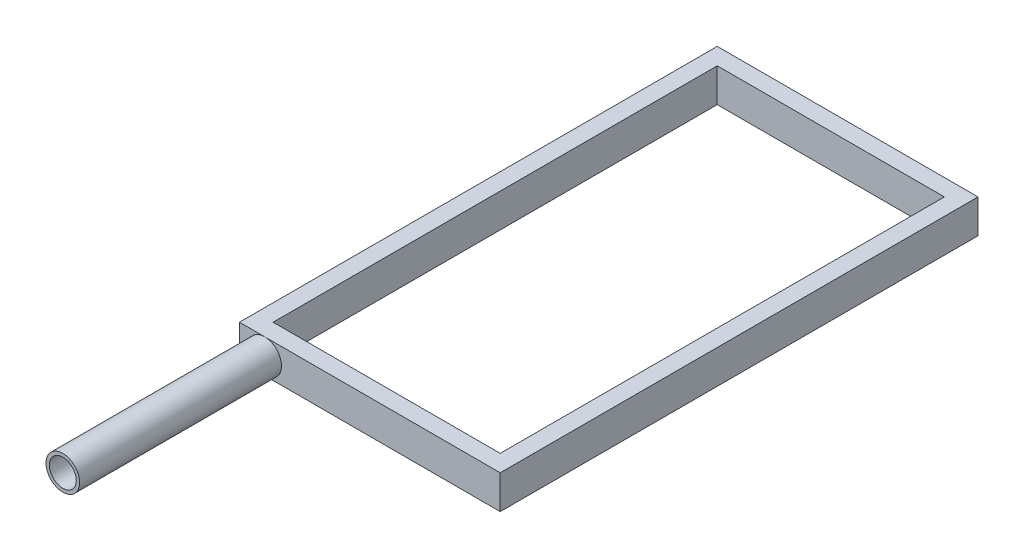
ISO-10303-21;
HEADER;
FILE_DESCRIPTION(('STEP AP214'),'2;1');
FILE_NAME('part.step','',(''),(''),'','','');
FILE_SCHEMA(('AUTOMOTIVE_DESIGN { 1 0 10303 214 1 1 1 1 }'));
ENDSEC;
DATA;
#1=APPLICATION_CONTEXT('core data for automotive mechanical design processes');
#2=APPLICATION_PROTOCOL_DEFINITION('international standard','automotive_design',2000,#1);
#3=PRODUCT_CONTEXT('',#1,'mechanical');
#4=PRODUCT('Part','Part','',(#3));
#5=PRODUCT_RELATED_PRODUCT_CATEGORY('part','',(#4));
#6=PRODUCT_DEFINITION_FORMATION('','',#4);
#7=PRODUCT_DEFINITION_CONTEXT('part definition',#1,'design');
#8=PRODUCT_DEFINITION('design','',#6,#7);
#9=PRODUCT_DEFINITION_SHAPE('','',#8);
#10=(LENGTH_UNIT() NAMED_UNIT(*) SI_UNIT(.MILLI.,.METRE.));
#11=(NAMED_UNIT(*) PLANE_ANGLE_UNIT() SI_UNIT($,.RADIAN.));
#12=(NAMED_UNIT(*) SI_UNIT($,.STERADIAN.) SOLID_ANGLE_UNIT());
#13=UNCERTAINTY_MEASURE_WITH_UNIT(LENGTH_MEASURE(1.E-05),#10,'distance_accuracy_value','');
#14=(GEOMETRIC_REPRESENTATION_CONTEXT(3) GLOBAL_UNCERTAINTY_ASSIGNED_CONTEXT((#13)) GLOBAL_UNIT_ASSIGNED_CONTEXT((#10,
#11,#12)) REPRESENTATION_CONTEXT('',''));
#15=CARTESIAN_POINT('',(0.,0.,0.));
#16=DIRECTION('',(0.,0.,1.));
#17=DIRECTION('',(1.,0.,0.));
#18=AXIS2_PLACEMENT_3D('',#15,#16,#17);
#19=CARTESIAN_POINT('',(0.,20.,10.));
#20=DIRECTION('',(0.,0.,-1.));
#21=DIRECTION('',(-1.,0.,0.));
#22=AXIS2_PLACEMENT_3D('',#19,#20,#21);
#23=PLANE('',#22);
#24=CARTESIAN_POINT('',(5.00000000000004,10.,10.));
#25=DIRECTION('',(0.,0.,1.));
#26=DIRECTION('',(1.,0.,0.));
#27=AXIS2_PLACEMENT_3D('',#24,#25,#26);
#28=CIRCLE('',#27,10.);
#29=CARTESIAN_POINT('',(5.00000000000004,20.,10.));
#30=VERTEX_POINT('',#29);
#31=CARTESIAN_POINT('',(5.00000000000004,0.,10.));
#32=VERTEX_POINT('',#31);
#33=EDGE_CURVE('E84',#30,#32,#28,.T.);
#34=ORIENTED_EDGE('',*,*,#33,.F.);
#35=DIRECTION('',(1.,0.,0.));
#36=VECTOR('',#35,1.);
#37=CARTESIAN_POINT('',(0.,20.,10.));
#38=LINE('',#37,#36);
#39=CARTESIAN_POINT('',(-9.99999999999991,20.,10.));
#40=VERTEX_POINT('',#39);
#41=EDGE_CURVE('E145',#40,#30,#38,.T.);
#42=ORIENTED_EDGE('',*,*,#41,.F.);
#43=DIRECTION('',(0.,-1.,0.));
#44=VECTOR('',#43,1.);
#45=CARTESIAN_POINT('',(-9.99999999999991,20.,10.));
#46=LINE('',#45,#44);
#47=CARTESIAN_POINT('',(-9.99999999999991,0.,10.));
#48=VERTEX_POINT('',#47);
#49=EDGE_CURVE('E77',#40,#48,#46,.T.);
#50=ORIENTED_EDGE('',*,*,#49,.T.);
#51=DIRECTION('',(1.,0.,0.));
#52=VECTOR('',#51,1.);
#53=CARTESIAN_POINT('',(0.,0.,10.));
#54=LINE('',#53,#52);
#55=EDGE_CURVE('E166',#48,#32,#54,.T.);
#56=ORIENTED_EDGE('',*,*,#55,.T.);
#57=EDGE_LOOP('',(#34,#42,#50,#56));
#58=FACE_BOUND('',#57,.T.);
#59=ADVANCED_FACE('F73',(#58),#23,.F.);
#60=CARTESIAN_POINT('',(-9.99999999999991,20.,10.));
#61=DIRECTION('',(0.,1.,0.));
#62=DIRECTION('',(0.,0.,1.));
#63=AXIS2_PLACEMENT_3D('',#60,#61,#62);
#64=PLANE('',#63);
#65=DIRECTION('',(0.,0.,1.));
#66=VECTOR('',#65,1.);
#67=CARTESIAN_POINT('',(-9.99999999999991,20.,-264.));
#68=LINE('',#67,#66);
#69=CARTESIAN_POINT('',(-9.99999999999999,20.,-274.));
#70=VERTEX_POINT('',#69);
#71=EDGE_CURVE('E151',#70,#40,#68,.T.);
#72=ORIENTED_EDGE('',*,*,#71,.T.);
#73=ORIENTED_EDGE('',*,*,#41,.T.);
#74=CARTESIAN_POINT('',(145.,20.,10.));
#75=VERTEX_POINT('',#74);
#76=EDGE_CURVE('E148',#30,#75,#38,.T.);
#77=ORIENTED_EDGE('',*,*,#76,.T.);
#78=DIRECTION('',(0.,0.,-1.));
#79=VECTOR('',#78,1.);
#80=CARTESIAN_POINT('',(145.,20.,-264.));
#81=LINE('',#80,#79);
#82=CARTESIAN_POINT('',(145.,20.,-274.));
#83=VERTEX_POINT('',#82);
#84=EDGE_CURVE('E157',#75,#83,#81,.T.);
#85=ORIENTED_EDGE('',*,*,#84,.T.);
#86=DIRECTION('',(-1.,0.,0.));
#87=VECTOR('',#86,1.);
#88=CARTESIAN_POINT('',(0.,20.,-274.));
#89=LINE('',#88,#87);
#90=EDGE_CURVE('E232',#83,#70,#89,.T.);
#91=ORIENTED_EDGE('',*,*,#90,.T.);
#92=EDGE_LOOP('',(#72,#73,#77,#85,#91));
#93=FACE_BOUND('',#92,.T.);
#94=DIRECTION('',(1.,0.,0.));
#95=VECTOR('',#94,1.);
#96=CARTESIAN_POINT('',(0.,20.,0.));
#97=LINE('',#96,#95);
#98=CARTESIAN_POINT('',(0.,20.,0.));
#99=VERTEX_POINT('',#98);
#100=CARTESIAN_POINT('',(135.,20.,0.));
#101=VERTEX_POINT('',#100);
#102=EDGE_CURVE('E269',#99,#101,#97,.T.);
#103=ORIENTED_EDGE('',*,*,#102,.F.);
#104=DIRECTION('',(0.,0.,1.));
#105=VECTOR('',#104,1.);
#106=CARTESIAN_POINT('',(0.,20.,0.));
#107=LINE('',#106,#105);
#108=CARTESIAN_POINT('',(0.,20.,-264.));
#109=VERTEX_POINT('',#108);
#110=EDGE_CURVE('E266',#109,#99,#107,.T.);
#111=ORIENTED_EDGE('',*,*,#110,.F.);
#112=DIRECTION('',(-1.,0.,0.));
#113=VECTOR('',#112,1.);
#114=CARTESIAN_POINT('',(0.,20.,-264.));
#115=LINE('',#114,#113);
#116=CARTESIAN_POINT('',(135.,20.,-264.));
#117=VERTEX_POINT('',#116);
#118=EDGE_CURVE('E312',#117,#109,#115,.T.);
#119=ORIENTED_EDGE('',*,*,#118,.F.);
#120=DIRECTION('',(0.,0.,-1.));
#121=VECTOR('',#120,1.);
#122=CARTESIAN_POINT('',(135.,20.,0.));
#123=LINE('',#122,#121);
#124=EDGE_CURVE('E286',#101,#117,#123,.T.);
#125=ORIENTED_EDGE('',*,*,#124,.F.);
#126=EDGE_LOOP('',(#103,#111,#119,#125));
#127=FACE_BOUND('',#126,.T.);
#128=ADVANCED_FACE('F146',(#93,#127),#64,.T.);
#129=CARTESIAN_POINT('',(-9.99999999999991,0.,10.));
#130=DIRECTION('',(0.,1.,0.));
#131=DIRECTION('',(0.,0.,1.));
#132=AXIS2_PLACEMENT_3D('',#129,#130,#131);
#133=PLANE('',#132);
#134=DIRECTION('',(0.,0.,1.));
#135=VECTOR('',#134,1.);
#136=CARTESIAN_POINT('',(-9.99999999999991,0.,-264.));
#137=LINE('',#136,#135);
#138=CARTESIAN_POINT('',(-9.99999999999999,0.,-274.));
#139=VERTEX_POINT('',#138);
#140=EDGE_CURVE('E215',#139,#48,#137,.T.);
#141=ORIENTED_EDGE('',*,*,#140,.F.);
#142=DIRECTION('',(-1.,0.,0.));
#143=VECTOR('',#142,1.);
#144=CARTESIAN_POINT('',(0.,0.,-274.));
#145=LINE('',#144,#143);
#146=CARTESIAN_POINT('',(145.,0.,-274.));
#147=VERTEX_POINT('',#146);
#148=EDGE_CURVE('E239',#147,#139,#145,.T.);
#149=ORIENTED_EDGE('',*,*,#148,.F.);
#150=DIRECTION('',(0.,0.,-1.));
#151=VECTOR('',#150,1.);
#152=CARTESIAN_POINT('',(145.,0.,-264.));
#153=LINE('',#152,#151);
#154=CARTESIAN_POINT('',(145.,0.,10.));
#155=VERTEX_POINT('',#154);
#156=EDGE_CURVE('E236',#155,#147,#153,.T.);
#157=ORIENTED_EDGE('',*,*,#156,.F.);
#158=EDGE_CURVE('E220',#32,#155,#54,.T.);
#159=ORIENTED_EDGE('',*,*,#158,.F.);
#160=ORIENTED_EDGE('',*,*,#55,.F.);
#161=EDGE_LOOP('',(#141,#149,#157,#159,#160));
#162=FACE_BOUND('',#161,.T.);
#163=DIRECTION('',(0.,0.,1.));
#164=VECTOR('',#163,1.);
#165=CARTESIAN_POINT('',(0.,0.,0.));
#166=LINE('',#165,#164);
#167=CARTESIAN_POINT('',(0.,0.,-264.));
#168=VERTEX_POINT('',#167);
#169=CARTESIAN_POINT('',(0.,0.,0.));
#170=VERTEX_POINT('',#169);
#171=EDGE_CURVE('E280',#168,#170,#166,.T.);
#172=ORIENTED_EDGE('',*,*,#171,.T.);
#173=DIRECTION('',(1.,0.,0.));
#174=VECTOR('',#173,1.);
#175=CARTESIAN_POINT('',(0.,0.,0.));
#176=LINE('',#175,#174);
#177=CARTESIAN_POINT('',(135.,0.,0.));
#178=VERTEX_POINT('',#177);
#179=EDGE_CURVE('E275',#170,#178,#176,.T.);
#180=ORIENTED_EDGE('',*,*,#179,.T.);
#181=DIRECTION('',(0.,0.,-1.));
#182=VECTOR('',#181,1.);
#183=CARTESIAN_POINT('',(135.,0.,0.));
#184=LINE('',#183,#182);
#185=CARTESIAN_POINT('',(135.,0.,-264.));
#186=VERTEX_POINT('',#185);
#187=EDGE_CURVE('E279',#178,#186,#184,.T.);
#188=ORIENTED_EDGE('',*,*,#187,.T.);
#189=DIRECTION('',(-1.,0.,0.));
#190=VECTOR('',#189,1.);
#191=CARTESIAN_POINT('',(0.,0.,-264.));
#192=LINE('',#191,#190);
#193=EDGE_CURVE('E270',#186,#168,#192,.T.);
#194=ORIENTED_EDGE('',*,*,#193,.T.);
#195=EDGE_LOOP('',(#172,#180,#188,#194));
#196=FACE_BOUND('',#195,.T.);
#197=ADVANCED_FACE('F193',(#162,#196),#133,.F.);
#198=CARTESIAN_POINT('',(-9.99999999999991,20.,-264.));
#199=DIRECTION('',(1.,0.,0.));
#200=DIRECTION('',(0.,0.,-1.));
#201=AXIS2_PLACEMENT_3D('',#198,#199,#200);
#202=PLANE('',#201);
#203=ORIENTED_EDGE('',*,*,#140,.T.);
#204=ORIENTED_EDGE('',*,*,#49,.F.);
#205=ORIENTED_EDGE('',*,*,#71,.F.);
#206=DIRECTION('',(0.,-1.,0.));
#207=VECTOR('',#206,1.);
#208=CARTESIAN_POINT('',(-9.99999999999999,20.,-274.));
#209=LINE('',#208,#207);
#210=EDGE_CURVE('E217',#70,#139,#209,.T.);
#211=ORIENTED_EDGE('',*,*,#210,.T.);
#212=EDGE_LOOP('',(#203,#204,#205,#211));
#213=FACE_BOUND('',#212,.T.);
#214=ADVANCED_FACE('F75',(#213),#202,.F.);
#215=EDGE_CURVE('E12',#32,#30,#28,.T.);
#216=ORIENTED_EDGE('',*,*,#215,.F.);
#217=ORIENTED_EDGE('',*,*,#158,.T.);
#218=DIRECTION('',(0.,-1.,0.));
#219=VECTOR('',#218,1.);
#220=CARTESIAN_POINT('',(145.,20.,10.));
#221=LINE('',#220,#219);
#222=EDGE_CURVE('E161',#75,#155,#221,.T.);
#223=ORIENTED_EDGE('',*,*,#222,.F.);
#224=ORIENTED_EDGE('',*,*,#76,.F.);
#225=EDGE_LOOP('',(#216,#217,#223,#224));
#226=FACE_BOUND('',#225,.T.);
#227=ADVANCED_FACE('F159',(#226),#23,.F.);
#228=CARTESIAN_POINT('',(145.,20.,-264.));
#229=DIRECTION('',(-1.,0.,0.));
#230=DIRECTION('',(0.,0.,1.));
#231=AXIS2_PLACEMENT_3D('',#228,#229,#230);
#232=PLANE('',#231);
#233=ORIENTED_EDGE('',*,*,#156,.T.);
#234=DIRECTION('',(0.,-1.,0.));
#235=VECTOR('',#234,1.);
#236=CARTESIAN_POINT('',(145.,20.,-274.));
#237=LINE('',#236,#235);
#238=EDGE_CURVE('E244',#83,#147,#237,.T.);
#239=ORIENTED_EDGE('',*,*,#238,.F.);
#240=ORIENTED_EDGE('',*,*,#84,.F.);
#241=ORIENTED_EDGE('',*,*,#222,.T.);
#242=EDGE_LOOP('',(#233,#239,#240,#241));
#243=FACE_BOUND('',#242,.T.);
#244=ADVANCED_FACE('F199',(#243),#232,.F.);
#245=CARTESIAN_POINT('',(0.,20.,-274.));
#246=DIRECTION('',(0.,0.,1.));
#247=DIRECTION('',(1.,0.,0.));
#248=AXIS2_PLACEMENT_3D('',#245,#246,#247);
#249=PLANE('',#248);
#250=ORIENTED_EDGE('',*,*,#148,.T.);
#251=ORIENTED_EDGE('',*,*,#210,.F.);
#252=ORIENTED_EDGE('',*,*,#90,.F.);
#253=ORIENTED_EDGE('',*,*,#238,.T.);
#254=EDGE_LOOP('',(#250,#251,#252,#253));
#255=FACE_BOUND('',#254,.T.);
#256=ADVANCED_FACE('F204',(#255),#249,.F.);
#257=CARTESIAN_POINT('',(0.,20.,0.));
#258=DIRECTION('',(1.,0.,0.));
#259=DIRECTION('',(0.,0.,-1.));
#260=AXIS2_PLACEMENT_3D('',#257,#258,#259);
#261=PLANE('',#260);
#262=ORIENTED_EDGE('',*,*,#171,.F.);
#263=DIRECTION('',(0.,-1.,0.));
#264=VECTOR('',#263,1.);
#265=CARTESIAN_POINT('',(0.,20.,-264.));
#266=LINE('',#265,#264);
#267=EDGE_CURVE('E308',#109,#168,#266,.T.);
#268=ORIENTED_EDGE('',*,*,#267,.F.);
#269=ORIENTED_EDGE('',*,*,#110,.T.);
#270=DIRECTION('',(0.,-1.,0.));
#271=VECTOR('',#270,1.);
#272=CARTESIAN_POINT('',(0.,20.,0.));
#273=LINE('',#272,#271);
#274=EDGE_CURVE('E221',#99,#170,#273,.T.);
#275=ORIENTED_EDGE('',*,*,#274,.T.);
#276=EDGE_LOOP('',(#262,#268,#269,#275));
#277=FACE_BOUND('',#276,.T.);
#278=ADVANCED_FACE('F377',(#277),#261,.T.);
#279=CARTESIAN_POINT('',(0.,20.,0.));
#280=DIRECTION('',(0.,0.,-1.));
#281=DIRECTION('',(-1.,0.,0.));
#282=AXIS2_PLACEMENT_3D('',#279,#280,#281);
#283=PLANE('',#282);
#284=ORIENTED_EDGE('',*,*,#179,.F.);
#285=ORIENTED_EDGE('',*,*,#274,.F.);
#286=ORIENTED_EDGE('',*,*,#102,.T.);
#287=DIRECTION('',(0.,-1.,0.));
#288=VECTOR('',#287,1.);
#289=CARTESIAN_POINT('',(135.,20.,0.));
#290=LINE('',#289,#288);
#291=EDGE_CURVE('E229',#101,#178,#290,.T.);
#292=ORIENTED_EDGE('',*,*,#291,.T.);
#293=EDGE_LOOP('',(#284,#285,#286,#292));
#294=FACE_BOUND('',#293,.T.);
#295=ADVANCED_FACE('F370',(#294),#283,.T.);
#296=CARTESIAN_POINT('',(135.,20.,0.));
#297=DIRECTION('',(-1.,0.,0.));
#298=DIRECTION('',(0.,0.,1.));
#299=AXIS2_PLACEMENT_3D('',#296,#297,#298);
#300=PLANE('',#299);
#301=ORIENTED_EDGE('',*,*,#187,.F.);
#302=ORIENTED_EDGE('',*,*,#291,.F.);
#303=ORIENTED_EDGE('',*,*,#124,.T.);
#304=DIRECTION('',(0.,-1.,0.));
#305=VECTOR('',#304,1.);
#306=CARTESIAN_POINT('',(135.,20.,-264.));
#307=LINE('',#306,#305);
#308=EDGE_CURVE('E97',#117,#186,#307,.T.);
#309=ORIENTED_EDGE('',*,*,#308,.T.);
#310=EDGE_LOOP('',(#301,#302,#303,#309));
#311=FACE_BOUND('',#310,.T.);
#312=ADVANCED_FACE('F373',(#311),#300,.T.);
#313=CARTESIAN_POINT('',(0.,20.,-264.));
#314=DIRECTION('',(0.,0.,1.));
#315=DIRECTION('',(1.,0.,0.));
#316=AXIS2_PLACEMENT_3D('',#313,#314,#315);
#317=PLANE('',#316);
#318=ORIENTED_EDGE('',*,*,#193,.F.);
#319=ORIENTED_EDGE('',*,*,#308,.F.);
#320=ORIENTED_EDGE('',*,*,#118,.T.);
#321=ORIENTED_EDGE('',*,*,#267,.T.);
#322=EDGE_LOOP('',(#318,#319,#320,#321));
#323=FACE_BOUND('',#322,.T.);
#324=ADVANCED_FACE('F184',(#323),#317,.T.);
#325=CARTESIAN_POINT('',(5.00000000000004,10.,130.));
#326=DIRECTION('',(0.,0.,1.));
#327=DIRECTION('',(1.,0.,0.));
#328=AXIS2_PLACEMENT_3D('',#325,#326,#327);
#329=PLANE('',#328);
#330=CARTESIAN_POINT('',(5.00000000000004,10.,130.));
#331=DIRECTION('',(0.,0.,1.));
#332=DIRECTION('',(1.,0.,0.));
#333=AXIS2_PLACEMENT_3D('',#330,#331,#332);
#334=CIRCLE('',#333,10.);
#335=CARTESIAN_POINT('',(15.,10.,130.));
#336=VERTEX_POINT('',#335);
#337=EDGE_CURVE('E169',#336,#336,#334,.T.);
#338=ORIENTED_EDGE('',*,*,#337,.T.);
#339=EDGE_LOOP('',(#338));
#340=FACE_BOUND('',#339,.T.);
#341=CARTESIAN_POINT('',(5.00000000000004,10.,130.));
#342=DIRECTION('',(0.,0.,1.));
#343=DIRECTION('',(1.,0.,0.));
#344=AXIS2_PLACEMENT_3D('',#341,#342,#343);
#345=CIRCLE('',#344,8.);
#346=CARTESIAN_POINT('',(13.,10.,130.));
#347=VERTEX_POINT('',#346);
#348=EDGE_CURVE('E170',#347,#347,#345,.T.);
#349=ORIENTED_EDGE('',*,*,#348,.F.);
#350=EDGE_LOOP('',(#349));
#351=FACE_BOUND('',#350,.T.);
#352=ADVANCED_FACE('F174',(#340,#351),#329,.T.);
#353=CARTESIAN_POINT('',(5.00000000000004,10.,130.));
#354=DIRECTION('',(0.,0.,-1.));
#355=DIRECTION('',(-1.,0.,0.));
#356=AXIS2_PLACEMENT_3D('',#353,#354,#355);
#357=CYLINDRICAL_SURFACE('',#356,10.);
#358=ORIENTED_EDGE('',*,*,#337,.F.);
#359=EDGE_LOOP('',(#358));
#360=FACE_BOUND('',#359,.T.);
#361=ORIENTED_EDGE('',*,*,#33,.T.);
#362=ORIENTED_EDGE('',*,*,#215,.T.);
#363=EDGE_LOOP('',(#361,#362));
#364=FACE_BOUND('',#363,.T.);
#365=ADVANCED_FACE('F171',(#360,#364),#357,.T.);
#366=CARTESIAN_POINT('',(5.00000000000004,10.,130.));
#367=DIRECTION('',(0.,0.,-1.));
#368=DIRECTION('',(-1.,0.,0.));
#369=AXIS2_PLACEMENT_3D('',#366,#367,#368);
#370=CYLINDRICAL_SURFACE('',#369,8.);
#371=ORIENTED_EDGE('',*,*,#348,.T.);
#372=EDGE_LOOP('',(#371));
#373=FACE_BOUND('',#372,.T.);
#374=CARTESIAN_POINT('',(5.00000000000004,10.,10.));
#375=DIRECTION('',(0.,0.,1.));
#376=DIRECTION('',(1.,0.,0.));
#377=AXIS2_PLACEMENT_3D('',#374,#375,#376);
#378=CIRCLE('',#377,8.);
#379=CARTESIAN_POINT('',(13.,10.,10.));
#380=VERTEX_POINT('',#379);
#381=EDGE_CURVE('E259',#380,#380,#378,.T.);
#382=ORIENTED_EDGE('',*,*,#381,.F.);
#383=EDGE_LOOP('',(#382));
#384=FACE_BOUND('',#383,.T.);
#385=ADVANCED_FACE('F173',(#373,#384),#370,.F.);
#386=ORIENTED_EDGE('',*,*,#381,.T.);
#387=EDGE_LOOP('',(#386));
#388=FACE_BOUND('',#387,.T.);
#389=ADVANCED_FACE('F181',(#388),#23,.F.);
#390=CLOSED_SHELL('',(#59,#128,#197,#214,#227,#244,#256,#278,#295,#312,#324,#352,#365,#385,#389));
#391=MANIFOLD_SOLID_BREP('B2',#390);
#392=ADVANCED_BREP_SHAPE_REPRESENTATION('',(#18,#391),#14);
#393=SHAPE_DEFINITION_REPRESENTATION(#9,#392);
ENDSEC;
END-ISO-10303-21;
